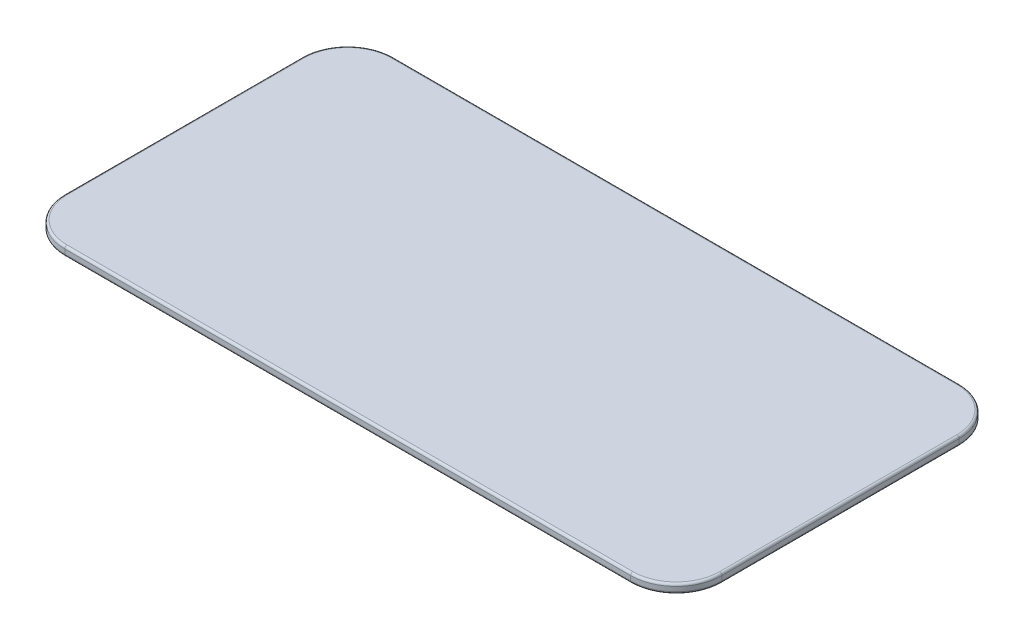
ISO-10303-21;
HEADER;
FILE_DESCRIPTION(('STEP AP214'),'2;1');
FILE_NAME('part.step','',(''),(''),'','','');
FILE_SCHEMA(('AUTOMOTIVE_DESIGN { 1 0 10303 214 1 1 1 1 }'));
ENDSEC;
DATA;
#1=APPLICATION_CONTEXT('core data for automotive mechanical design processes');
#2=APPLICATION_PROTOCOL_DEFINITION('international standard','automotive_design',2000,#1);
#3=PRODUCT_CONTEXT('',#1,'mechanical');
#4=PRODUCT('Part','Part','',(#3));
#5=PRODUCT_RELATED_PRODUCT_CATEGORY('part','',(#4));
#6=PRODUCT_DEFINITION_FORMATION('','',#4);
#7=PRODUCT_DEFINITION_CONTEXT('part definition',#1,'design');
#8=PRODUCT_DEFINITION('design','',#6,#7);
#9=PRODUCT_DEFINITION_SHAPE('','',#8);
#10=(LENGTH_UNIT() NAMED_UNIT(*) SI_UNIT(.MILLI.,.METRE.));
#11=(NAMED_UNIT(*) PLANE_ANGLE_UNIT() SI_UNIT($,.RADIAN.));
#12=(NAMED_UNIT(*) SI_UNIT($,.STERADIAN.) SOLID_ANGLE_UNIT());
#13=UNCERTAINTY_MEASURE_WITH_UNIT(LENGTH_MEASURE(1.E-05),#10,'distance_accuracy_value','');
#14=(GEOMETRIC_REPRESENTATION_CONTEXT(3) GLOBAL_UNCERTAINTY_ASSIGNED_CONTEXT((#13)) GLOBAL_UNIT_ASSIGNED_CONTEXT((#10,
#11,#12)) REPRESENTATION_CONTEXT('',''));
#15=CARTESIAN_POINT('',(0.,0.,0.));
#16=DIRECTION('',(0.,0.,1.));
#17=DIRECTION('',(1.,0.,0.));
#18=AXIS2_PLACEMENT_3D('',#15,#16,#17);
#19=CARTESIAN_POINT('',(914.4,25.4,457.2));
#20=DIRECTION('',(-1.,0.,0.));
#21=DIRECTION('',(0.,0.,1.));
#22=AXIS2_PLACEMENT_3D('',#19,#20,#21);
#23=PLANE('',#22);
#24=DIRECTION('',(0.,-1.,0.));
#25=VECTOR('',#24,1.);
#26=CARTESIAN_POINT('',(914.4,25.4,330.2));
#27=LINE('',#26,#25);
#28=CARTESIAN_POINT('',(914.4,19.05,330.2));
#29=VERTEX_POINT('',#28);
#30=CARTESIAN_POINT('',(914.4,6.35,330.2));
#31=VERTEX_POINT('',#30);
#32=EDGE_CURVE('E355',#29,#31,#27,.T.);
#33=ORIENTED_EDGE('',*,*,#32,.T.);
#34=DIRECTION('',(0.,0.,-1.));
#35=VECTOR('',#34,1.);
#36=CARTESIAN_POINT('',(914.4,6.35,-330.2));
#37=LINE('',#36,#35);
#38=CARTESIAN_POINT('',(914.4,6.35,-330.2));
#39=VERTEX_POINT('',#38);
#40=EDGE_CURVE('E213',#31,#39,#37,.T.);
#41=ORIENTED_EDGE('',*,*,#40,.T.);
#42=DIRECTION('',(0.,-1.,0.));
#43=VECTOR('',#42,1.);
#44=CARTESIAN_POINT('',(914.4,25.4,-330.2));
#45=LINE('',#44,#43);
#46=CARTESIAN_POINT('',(914.4,19.05,-330.2));
#47=VERTEX_POINT('',#46);
#48=EDGE_CURVE('E180',#39,#47,#45,.F.);
#49=ORIENTED_EDGE('',*,*,#48,.T.);
#50=DIRECTION('',(0.,0.,-1.));
#51=VECTOR('',#50,1.);
#52=CARTESIAN_POINT('',(914.4,19.05,457.2));
#53=LINE('',#52,#51);
#54=EDGE_CURVE('E210',#47,#29,#53,.F.);
#55=ORIENTED_EDGE('',*,*,#54,.T.);
#56=EDGE_LOOP('',(#33,#41,#49,#55));
#57=FACE_BOUND('',#56,.T.);
#58=ADVANCED_FACE('F44',(#57),#23,.F.);
#59=CARTESIAN_POINT('',(-914.4,25.4,-457.2));
#60=DIRECTION('',(0.,0.,1.));
#61=DIRECTION('',(1.,0.,0.));
#62=AXIS2_PLACEMENT_3D('',#59,#60,#61);
#63=PLANE('',#62);
#64=DIRECTION('',(0.,-1.,0.));
#65=VECTOR('',#64,1.);
#66=CARTESIAN_POINT('',(787.4,25.4,-457.2));
#67=LINE('',#66,#65);
#68=CARTESIAN_POINT('',(787.4,19.05,-457.2));
#69=VERTEX_POINT('',#68);
#70=CARTESIAN_POINT('',(787.4,6.35,-457.2));
#71=VERTEX_POINT('',#70);
#72=EDGE_CURVE('E339',#69,#71,#67,.T.);
#73=ORIENTED_EDGE('',*,*,#72,.T.);
#74=DIRECTION('',(-1.,0.,0.));
#75=VECTOR('',#74,1.);
#76=CARTESIAN_POINT('',(-787.400000000001,6.35,-457.2));
#77=LINE('',#76,#75);
#78=CARTESIAN_POINT('',(-787.4,6.35,-457.2));
#79=VERTEX_POINT('',#78);
#80=EDGE_CURVE('E226',#71,#79,#77,.T.);
#81=ORIENTED_EDGE('',*,*,#80,.T.);
#82=DIRECTION('',(0.,-1.,0.));
#83=VECTOR('',#82,1.);
#84=CARTESIAN_POINT('',(-787.4,25.4,-457.2));
#85=LINE('',#84,#83);
#86=CARTESIAN_POINT('',(-787.4,19.05,-457.2));
#87=VERTEX_POINT('',#86);
#88=EDGE_CURVE('E345',#79,#87,#85,.F.);
#89=ORIENTED_EDGE('',*,*,#88,.T.);
#90=DIRECTION('',(-1.,0.,0.));
#91=VECTOR('',#90,1.);
#92=CARTESIAN_POINT('',(-914.4,19.05,-457.2));
#93=LINE('',#92,#91);
#94=EDGE_CURVE('E223',#87,#69,#93,.F.);
#95=ORIENTED_EDGE('',*,*,#94,.T.);
#96=EDGE_LOOP('',(#73,#81,#89,#95));
#97=FACE_BOUND('',#96,.T.);
#98=ADVANCED_FACE('F413',(#97),#63,.F.);
#99=CARTESIAN_POINT('',(-914.4,25.4,457.2));
#100=DIRECTION('',(1.,0.,0.));
#101=DIRECTION('',(0.,0.,-1.));
#102=AXIS2_PLACEMENT_3D('',#99,#100,#101);
#103=PLANE('',#102);
#104=DIRECTION('',(0.,-1.,0.));
#105=VECTOR('',#104,1.);
#106=CARTESIAN_POINT('',(-914.4,25.4,-330.2));
#107=LINE('',#106,#105);
#108=CARTESIAN_POINT('',(-914.4,19.05,-330.2));
#109=VERTEX_POINT('',#108);
#110=CARTESIAN_POINT('',(-914.4,6.35,-330.2));
#111=VERTEX_POINT('',#110);
#112=EDGE_CURVE('E336',#109,#111,#107,.T.);
#113=ORIENTED_EDGE('',*,*,#112,.T.);
#114=DIRECTION('',(0.,0.,1.));
#115=VECTOR('',#114,1.);
#116=CARTESIAN_POINT('',(-914.4,6.35,330.2));
#117=LINE('',#116,#115);
#118=CARTESIAN_POINT('',(-914.4,6.35,330.2));
#119=VERTEX_POINT('',#118);
#120=EDGE_CURVE('E238',#111,#119,#117,.T.);
#121=ORIENTED_EDGE('',*,*,#120,.T.);
#122=DIRECTION('',(0.,-1.,0.));
#123=VECTOR('',#122,1.);
#124=CARTESIAN_POINT('',(-914.4,25.4,330.2));
#125=LINE('',#124,#123);
#126=CARTESIAN_POINT('',(-914.4,19.05,330.2));
#127=VERTEX_POINT('',#126);
#128=EDGE_CURVE('E284',#119,#127,#125,.F.);
#129=ORIENTED_EDGE('',*,*,#128,.T.);
#130=DIRECTION('',(0.,0.,1.));
#131=VECTOR('',#130,1.);
#132=CARTESIAN_POINT('',(-914.4,19.05,457.2));
#133=LINE('',#132,#131);
#134=EDGE_CURVE('E235',#127,#109,#133,.F.);
#135=ORIENTED_EDGE('',*,*,#134,.T.);
#136=EDGE_LOOP('',(#113,#121,#129,#135));
#137=FACE_BOUND('',#136,.T.);
#138=ADVANCED_FACE('F333',(#137),#103,.F.);
#139=CARTESIAN_POINT('',(-914.4,25.4,457.2));
#140=DIRECTION('',(0.,0.,-1.));
#141=DIRECTION('',(-1.,0.,0.));
#142=AXIS2_PLACEMENT_3D('',#139,#140,#141);
#143=PLANE('',#142);
#144=DIRECTION('',(0.,-1.,0.));
#145=VECTOR('',#144,1.);
#146=CARTESIAN_POINT('',(-787.4,25.4,457.2));
#147=LINE('',#146,#145);
#148=CARTESIAN_POINT('',(-787.4,19.05,457.2));
#149=VERTEX_POINT('',#148);
#150=CARTESIAN_POINT('',(-787.4,6.35,457.2));
#151=VERTEX_POINT('',#150);
#152=EDGE_CURVE('E330',#149,#151,#147,.T.);
#153=ORIENTED_EDGE('',*,*,#152,.T.);
#154=DIRECTION('',(1.,0.,0.));
#155=VECTOR('',#154,1.);
#156=CARTESIAN_POINT('',(787.4,6.35,457.2));
#157=LINE('',#156,#155);
#158=CARTESIAN_POINT('',(787.4,6.35,457.2));
#159=VERTEX_POINT('',#158);
#160=EDGE_CURVE('E201',#151,#159,#157,.T.);
#161=ORIENTED_EDGE('',*,*,#160,.T.);
#162=DIRECTION('',(0.,-1.,0.));
#163=VECTOR('',#162,1.);
#164=CARTESIAN_POINT('',(787.4,25.4,457.2));
#165=LINE('',#164,#163);
#166=CARTESIAN_POINT('',(787.4,19.05,457.2));
#167=VERTEX_POINT('',#166);
#168=EDGE_CURVE('E349',#159,#167,#165,.F.);
#169=ORIENTED_EDGE('',*,*,#168,.T.);
#170=DIRECTION('',(1.,0.,0.));
#171=VECTOR('',#170,1.);
#172=CARTESIAN_POINT('',(-914.4,19.05,457.2));
#173=LINE('',#172,#171);
#174=EDGE_CURVE('E198',#167,#149,#173,.F.);
#175=ORIENTED_EDGE('',*,*,#174,.T.);
#176=EDGE_LOOP('',(#153,#161,#169,#175));
#177=FACE_BOUND('',#176,.T.);
#178=ADVANCED_FACE('F385',(#177),#143,.F.);
#179=CARTESIAN_POINT('',(0.,25.4,0.));
#180=DIRECTION('',(0.,-1.,0.));
#181=DIRECTION('',(0.,0.,-1.));
#182=AXIS2_PLACEMENT_3D('',#179,#180,#181);
#183=PLANE('',#182);
#184=DIRECTION('',(0.,0.,-1.));
#185=VECTOR('',#184,1.);
#186=CARTESIAN_POINT('',(908.05,25.4,0.));
#187=LINE('',#186,#185);
#188=CARTESIAN_POINT('',(908.05,25.4,330.2));
#189=VERTEX_POINT('',#188);
#190=CARTESIAN_POINT('',(908.05,25.4,-330.2));
#191=VERTEX_POINT('',#190);
#192=EDGE_CURVE('E54',#189,#191,#187,.T.);
#193=ORIENTED_EDGE('',*,*,#192,.T.);
#194=CARTESIAN_POINT('',(787.4,25.4,-330.2));
#195=DIRECTION('',(0.,-1.,0.));
#196=DIRECTION('',(0.,0.,-1.));
#197=AXIS2_PLACEMENT_3D('',#194,#195,#196);
#198=CIRCLE('',#197,120.65);
#199=CARTESIAN_POINT('',(787.4,25.4,-450.85));
#200=VERTEX_POINT('',#199);
#201=EDGE_CURVE('E11',#191,#200,#198,.F.);
#202=ORIENTED_EDGE('',*,*,#201,.T.);
#203=DIRECTION('',(-1.,0.,0.));
#204=VECTOR('',#203,1.);
#205=CARTESIAN_POINT('',(0.,25.4,-450.85));
#206=LINE('',#205,#204);
#207=CARTESIAN_POINT('',(-787.4,25.4,-450.85));
#208=VERTEX_POINT('',#207);
#209=EDGE_CURVE('E241',#200,#208,#206,.T.);
#210=ORIENTED_EDGE('',*,*,#209,.T.);
#211=CARTESIAN_POINT('',(-787.4,25.4,-330.2));
#212=DIRECTION('',(0.,-1.,0.));
#213=DIRECTION('',(0.,0.,-1.));
#214=AXIS2_PLACEMENT_3D('',#211,#212,#213);
#215=CIRCLE('',#214,120.65);
#216=CARTESIAN_POINT('',(-908.050000000001,25.4,-330.2));
#217=VERTEX_POINT('',#216);
#218=EDGE_CURVE('E244',#208,#217,#215,.F.);
#219=ORIENTED_EDGE('',*,*,#218,.T.);
#220=DIRECTION('',(0.,0.,1.));
#221=VECTOR('',#220,1.);
#222=CARTESIAN_POINT('',(-908.050000000001,25.4,0.));
#223=LINE('',#222,#221);
#224=CARTESIAN_POINT('',(-908.050000000001,25.4,330.2));
#225=VERTEX_POINT('',#224);
#226=EDGE_CURVE('E247',#217,#225,#223,.T.);
#227=ORIENTED_EDGE('',*,*,#226,.T.);
#228=CARTESIAN_POINT('',(-787.4,25.4,330.2));
#229=DIRECTION('',(0.,-1.,0.));
#230=DIRECTION('',(0.,0.,-1.));
#231=AXIS2_PLACEMENT_3D('',#228,#229,#230);
#232=CIRCLE('',#231,120.65);
#233=CARTESIAN_POINT('',(-787.4,25.4,450.85));
#234=VERTEX_POINT('',#233);
#235=EDGE_CURVE('E250',#225,#234,#232,.F.);
#236=ORIENTED_EDGE('',*,*,#235,.T.);
#237=DIRECTION('',(1.,0.,0.));
#238=VECTOR('',#237,1.);
#239=CARTESIAN_POINT('',(0.,25.4,450.85));
#240=LINE('',#239,#238);
#241=CARTESIAN_POINT('',(787.4,25.4,450.85));
#242=VERTEX_POINT('',#241);
#243=EDGE_CURVE('E253',#234,#242,#240,.T.);
#244=ORIENTED_EDGE('',*,*,#243,.T.);
#245=CARTESIAN_POINT('',(787.4,25.4,330.2));
#246=DIRECTION('',(0.,-1.,0.));
#247=DIRECTION('',(0.,0.,-1.));
#248=AXIS2_PLACEMENT_3D('',#245,#246,#247);
#249=CIRCLE('',#248,120.65);
#250=EDGE_CURVE('E65',#242,#189,#249,.F.);
#251=ORIENTED_EDGE('',*,*,#250,.T.);
#252=EDGE_LOOP('',(#193,#202,#210,#219,#227,#236,#244,#251));
#253=FACE_BOUND('',#252,.T.);
#254=ADVANCED_FACE('F401',(#253),#183,.F.);
#255=CARTESIAN_POINT('',(0.,0.,0.));
#256=DIRECTION('',(0.,-1.,0.));
#257=DIRECTION('',(0.,0.,-1.));
#258=AXIS2_PLACEMENT_3D('',#255,#256,#257);
#259=PLANE('',#258);
#260=DIRECTION('',(1.,0.,0.));
#261=VECTOR('',#260,1.);
#262=CARTESIAN_POINT('',(-787.400000000001,0.,450.85));
#263=LINE('',#262,#261);
#264=CARTESIAN_POINT('',(787.4,0.,450.85));
#265=VERTEX_POINT('',#264);
#266=CARTESIAN_POINT('',(-787.4,0.,450.85));
#267=VERTEX_POINT('',#266);
#268=EDGE_CURVE('E184',#265,#267,#263,.F.);
#269=ORIENTED_EDGE('',*,*,#268,.T.);
#270=CARTESIAN_POINT('',(-787.4,0.,330.2));
#271=DIRECTION('',(0.,-1.,0.));
#272=DIRECTION('',(0.,0.,-1.));
#273=AXIS2_PLACEMENT_3D('',#270,#271,#272);
#274=CIRCLE('',#273,120.65);
#275=CARTESIAN_POINT('',(-908.050000000001,0.,330.2));
#276=VERTEX_POINT('',#275);
#277=EDGE_CURVE('E163',#267,#276,#274,.T.);
#278=ORIENTED_EDGE('',*,*,#277,.T.);
#279=DIRECTION('',(0.,0.,1.));
#280=VECTOR('',#279,1.);
#281=CARTESIAN_POINT('',(-908.050000000001,0.,-330.2));
#282=LINE('',#281,#280);
#283=CARTESIAN_POINT('',(-908.050000000001,0.,-330.2));
#284=VERTEX_POINT('',#283);
#285=EDGE_CURVE('E172',#276,#284,#282,.F.);
#286=ORIENTED_EDGE('',*,*,#285,.T.);
#287=CARTESIAN_POINT('',(-787.4,0.,-330.2));
#288=DIRECTION('',(0.,-1.,0.));
#289=DIRECTION('',(0.,0.,-1.));
#290=AXIS2_PLACEMENT_3D('',#287,#288,#289);
#291=CIRCLE('',#290,120.65);
#292=CARTESIAN_POINT('',(-787.4,0.,-450.85));
#293=VERTEX_POINT('',#292);
#294=EDGE_CURVE('E179',#284,#293,#291,.T.);
#295=ORIENTED_EDGE('',*,*,#294,.T.);
#296=DIRECTION('',(-1.,0.,0.));
#297=VECTOR('',#296,1.);
#298=CARTESIAN_POINT('',(787.4,0.,-450.85));
#299=LINE('',#298,#297);
#300=CARTESIAN_POINT('',(787.4,0.,-450.85));
#301=VERTEX_POINT('',#300);
#302=EDGE_CURVE('E364',#293,#301,#299,.F.);
#303=ORIENTED_EDGE('',*,*,#302,.T.);
#304=CARTESIAN_POINT('',(787.4,0.,-330.2));
#305=DIRECTION('',(0.,-1.,0.));
#306=DIRECTION('',(0.,0.,-1.));
#307=AXIS2_PLACEMENT_3D('',#304,#305,#306);
#308=CIRCLE('',#307,120.65);
#309=CARTESIAN_POINT('',(908.05,0.,-330.2));
#310=VERTEX_POINT('',#309);
#311=EDGE_CURVE('E367',#301,#310,#308,.T.);
#312=ORIENTED_EDGE('',*,*,#311,.T.);
#313=DIRECTION('',(0.,0.,-1.));
#314=VECTOR('',#313,1.);
#315=CARTESIAN_POINT('',(908.05,0.,330.2));
#316=LINE('',#315,#314);
#317=CARTESIAN_POINT('',(908.05,0.,330.2));
#318=VERTEX_POINT('',#317);
#319=EDGE_CURVE('E370',#310,#318,#316,.F.);
#320=ORIENTED_EDGE('',*,*,#319,.T.);
#321=CARTESIAN_POINT('',(787.4,0.,330.2));
#322=DIRECTION('',(0.,-1.,0.));
#323=DIRECTION('',(0.,0.,-1.));
#324=AXIS2_PLACEMENT_3D('',#321,#322,#323);
#325=CIRCLE('',#324,120.65);
#326=EDGE_CURVE('E192',#318,#265,#325,.T.);
#327=ORIENTED_EDGE('',*,*,#326,.T.);
#328=EDGE_LOOP('',(#269,#278,#286,#295,#303,#312,#320,#327));
#329=FACE_BOUND('',#328,.T.);
#330=ADVANCED_FACE('F182',(#329),#259,.T.);
#331=CARTESIAN_POINT('',(-787.4,25.4,-330.2));
#332=DIRECTION('',(0.,-1.,0.));
#333=DIRECTION('',(0.,0.,-1.));
#334=AXIS2_PLACEMENT_3D('',#331,#332,#333);
#335=CYLINDRICAL_SURFACE('',#334,127.);
#336=ORIENTED_EDGE('',*,*,#88,.F.);
#337=CARTESIAN_POINT('',(-787.4,6.35,-330.2));
#338=DIRECTION('',(0.,-1.,0.));
#339=DIRECTION('',(0.,0.,-1.));
#340=AXIS2_PLACEMENT_3D('',#337,#338,#339);
#341=CIRCLE('',#340,127.);
#342=EDGE_CURVE('E232',#79,#111,#341,.F.);
#343=ORIENTED_EDGE('',*,*,#342,.T.);
#344=ORIENTED_EDGE('',*,*,#112,.F.);
#345=CARTESIAN_POINT('',(-787.4,19.05,-330.2));
#346=DIRECTION('',(0.,-1.,0.));
#347=DIRECTION('',(0.,0.,-1.));
#348=AXIS2_PLACEMENT_3D('',#345,#346,#347);
#349=CIRCLE('',#348,127.);
#350=EDGE_CURVE('E229',#109,#87,#349,.T.);
#351=ORIENTED_EDGE('',*,*,#350,.T.);
#352=EDGE_LOOP('',(#336,#343,#344,#351));
#353=FACE_BOUND('',#352,.T.);
#354=ADVANCED_FACE('F437',(#353),#335,.T.);
#355=CARTESIAN_POINT('',(-787.4,25.4,330.2));
#356=DIRECTION('',(0.,-1.,0.));
#357=DIRECTION('',(0.,0.,-1.));
#358=AXIS2_PLACEMENT_3D('',#355,#356,#357);
#359=CYLINDRICAL_SURFACE('',#358,127.);
#360=ORIENTED_EDGE('',*,*,#128,.F.);
#361=CARTESIAN_POINT('',(-787.4,6.35,330.2));
#362=DIRECTION('',(0.,-1.,0.));
#363=DIRECTION('',(0.,0.,-1.));
#364=AXIS2_PLACEMENT_3D('',#361,#362,#363);
#365=CIRCLE('',#364,127.);
#366=EDGE_CURVE('E165',#119,#151,#365,.F.);
#367=ORIENTED_EDGE('',*,*,#366,.T.);
#368=ORIENTED_EDGE('',*,*,#152,.F.);
#369=CARTESIAN_POINT('',(-787.4,19.05,330.2));
#370=DIRECTION('',(0.,-1.,0.));
#371=DIRECTION('',(0.,0.,-1.));
#372=AXIS2_PLACEMENT_3D('',#369,#370,#371);
#373=CIRCLE('',#372,127.);
#374=EDGE_CURVE('E187',#149,#127,#373,.T.);
#375=ORIENTED_EDGE('',*,*,#374,.T.);
#376=EDGE_LOOP('',(#360,#367,#368,#375));
#377=FACE_BOUND('',#376,.T.);
#378=ADVANCED_FACE('F328',(#377),#359,.T.);
#379=CARTESIAN_POINT('',(787.4,25.4,-330.2));
#380=DIRECTION('',(0.,-1.,0.));
#381=DIRECTION('',(0.,0.,-1.));
#382=AXIS2_PLACEMENT_3D('',#379,#380,#381);
#383=CYLINDRICAL_SURFACE('',#382,127.);
#384=ORIENTED_EDGE('',*,*,#48,.F.);
#385=CARTESIAN_POINT('',(787.4,6.35,-330.2));
#386=DIRECTION('',(0.,-1.,0.));
#387=DIRECTION('',(0.,0.,-1.));
#388=AXIS2_PLACEMENT_3D('',#385,#386,#387);
#389=CIRCLE('',#388,127.);
#390=EDGE_CURVE('E220',#39,#71,#389,.F.);
#391=ORIENTED_EDGE('',*,*,#390,.T.);
#392=ORIENTED_EDGE('',*,*,#72,.F.);
#393=CARTESIAN_POINT('',(787.4,19.05,-330.2));
#394=DIRECTION('',(0.,-1.,0.));
#395=DIRECTION('',(0.,0.,-1.));
#396=AXIS2_PLACEMENT_3D('',#393,#394,#395);
#397=CIRCLE('',#396,127.);
#398=EDGE_CURVE('E216',#69,#47,#397,.T.);
#399=ORIENTED_EDGE('',*,*,#398,.T.);
#400=EDGE_LOOP('',(#384,#391,#392,#399));
#401=FACE_BOUND('',#400,.T.);
#402=ADVANCED_FACE('F418',(#401),#383,.T.);
#403=CARTESIAN_POINT('',(787.4,25.4,330.2));
#404=DIRECTION('',(0.,-1.,0.));
#405=DIRECTION('',(0.,0.,-1.));
#406=AXIS2_PLACEMENT_3D('',#403,#404,#405);
#407=CYLINDRICAL_SURFACE('',#406,127.);
#408=ORIENTED_EDGE('',*,*,#168,.F.);
#409=CARTESIAN_POINT('',(787.4,6.35,330.2));
#410=DIRECTION('',(0.,-1.,0.));
#411=DIRECTION('',(0.,0.,-1.));
#412=AXIS2_PLACEMENT_3D('',#409,#410,#411);
#413=CIRCLE('',#412,127.);
#414=EDGE_CURVE('E207',#159,#31,#413,.F.);
#415=ORIENTED_EDGE('',*,*,#414,.T.);
#416=ORIENTED_EDGE('',*,*,#32,.F.);
#417=CARTESIAN_POINT('',(787.4,19.05,330.2));
#418=DIRECTION('',(0.,-1.,0.));
#419=DIRECTION('',(0.,0.,-1.));
#420=AXIS2_PLACEMENT_3D('',#417,#418,#419);
#421=CIRCLE('',#420,127.);
#422=EDGE_CURVE('E204',#29,#167,#421,.T.);
#423=ORIENTED_EDGE('',*,*,#422,.T.);
#424=EDGE_LOOP('',(#408,#415,#416,#423));
#425=FACE_BOUND('',#424,.T.);
#426=ADVANCED_FACE('F387',(#425),#407,.T.);
#427=CARTESIAN_POINT('',(787.4,6.35,-330.2));
#428=DIRECTION('',(0.,-1.,0.));
#429=DIRECTION('',(0.,0.,-1.));
#430=AXIS2_PLACEMENT_3D('',#427,#428,#429);
#431=TOROIDAL_SURFACE('',#430,120.65,6.35);
#432=CARTESIAN_POINT('',(787.4,6.35,-450.85));
#433=DIRECTION('',(-1.,0.,0.));
#434=DIRECTION('',(0.,0.,1.));
#435=AXIS2_PLACEMENT_3D('',#432,#433,#434);
#436=CIRCLE('',#435,6.35);
#437=EDGE_CURVE('E276',#71,#301,#436,.T.);
#438=ORIENTED_EDGE('',*,*,#437,.F.);
#439=ORIENTED_EDGE('',*,*,#390,.F.);
#440=CARTESIAN_POINT('',(908.05,6.35,-330.2));
#441=DIRECTION('',(0.,0.,1.));
#442=DIRECTION('',(1.,0.,0.));
#443=AXIS2_PLACEMENT_3D('',#440,#441,#442);
#444=CIRCLE('',#443,6.35);
#445=EDGE_CURVE('E280',#310,#39,#444,.T.);
#446=ORIENTED_EDGE('',*,*,#445,.F.);
#447=ORIENTED_EDGE('',*,*,#311,.F.);
#448=EDGE_LOOP('',(#438,#439,#446,#447));
#449=FACE_BOUND('',#448,.T.);
#450=ADVANCED_FACE('F422',(#449),#431,.T.);
#451=CARTESIAN_POINT('',(908.05,6.35,457.2));
#452=DIRECTION('',(0.,0.,1.));
#453=DIRECTION('',(1.,0.,0.));
#454=AXIS2_PLACEMENT_3D('',#451,#452,#453);
#455=CYLINDRICAL_SURFACE('',#454,6.35);
#456=ORIENTED_EDGE('',*,*,#445,.T.);
#457=ORIENTED_EDGE('',*,*,#40,.F.);
#458=CARTESIAN_POINT('',(908.05,6.35,330.2));
#459=DIRECTION('',(0.,0.,1.));
#460=DIRECTION('',(1.,0.,0.));
#461=AXIS2_PLACEMENT_3D('',#458,#459,#460);
#462=CIRCLE('',#461,6.35);
#463=EDGE_CURVE('E272',#318,#31,#462,.T.);
#464=ORIENTED_EDGE('',*,*,#463,.F.);
#465=ORIENTED_EDGE('',*,*,#319,.F.);
#466=EDGE_LOOP('',(#456,#457,#464,#465));
#467=FACE_BOUND('',#466,.T.);
#468=ADVANCED_FACE('F427',(#467),#455,.T.);
#469=CARTESIAN_POINT('',(-914.4,6.35,-450.85));
#470=DIRECTION('',(1.,0.,0.));
#471=DIRECTION('',(0.,0.,-1.));
#472=AXIS2_PLACEMENT_3D('',#469,#470,#471);
#473=CYLINDRICAL_SURFACE('',#472,6.35);
#474=ORIENTED_EDGE('',*,*,#437,.T.);
#475=ORIENTED_EDGE('',*,*,#302,.F.);
#476=CARTESIAN_POINT('',(-787.4,6.35,-450.85));
#477=DIRECTION('',(-1.,0.,0.));
#478=DIRECTION('',(0.,0.,1.));
#479=AXIS2_PLACEMENT_3D('',#476,#477,#478);
#480=CIRCLE('',#479,6.35);
#481=EDGE_CURVE('E268',#79,#293,#480,.T.);
#482=ORIENTED_EDGE('',*,*,#481,.F.);
#483=ORIENTED_EDGE('',*,*,#80,.F.);
#484=EDGE_LOOP('',(#474,#475,#482,#483));
#485=FACE_BOUND('',#484,.T.);
#486=ADVANCED_FACE('F459',(#485),#473,.T.);
#487=CARTESIAN_POINT('',(787.4,6.35,330.2));
#488=DIRECTION('',(0.,-1.,0.));
#489=DIRECTION('',(0.,0.,-1.));
#490=AXIS2_PLACEMENT_3D('',#487,#488,#489);
#491=TOROIDAL_SURFACE('',#490,120.65,6.35);
#492=ORIENTED_EDGE('',*,*,#463,.T.);
#493=ORIENTED_EDGE('',*,*,#414,.F.);
#494=CARTESIAN_POINT('',(787.4,6.35,450.85));
#495=DIRECTION('',(-1.,0.,0.));
#496=DIRECTION('',(0.,0.,1.));
#497=AXIS2_PLACEMENT_3D('',#494,#495,#496);
#498=CIRCLE('',#497,6.35);
#499=EDGE_CURVE('E264',#265,#159,#498,.T.);
#500=ORIENTED_EDGE('',*,*,#499,.F.);
#501=ORIENTED_EDGE('',*,*,#326,.F.);
#502=EDGE_LOOP('',(#492,#493,#500,#501));
#503=FACE_BOUND('',#502,.T.);
#504=ADVANCED_FACE('F379',(#503),#491,.T.);
#505=CARTESIAN_POINT('',(-787.4,6.35,-330.2));
#506=DIRECTION('',(0.,-1.,0.));
#507=DIRECTION('',(0.,0.,-1.));
#508=AXIS2_PLACEMENT_3D('',#505,#506,#507);
#509=TOROIDAL_SURFACE('',#508,120.65,6.35);
#510=ORIENTED_EDGE('',*,*,#481,.T.);
#511=ORIENTED_EDGE('',*,*,#294,.F.);
#512=CARTESIAN_POINT('',(-908.050000000001,6.35,-330.2));
#513=DIRECTION('',(0.,0.,1.));
#514=DIRECTION('',(1.,0.,0.));
#515=AXIS2_PLACEMENT_3D('',#512,#513,#514);
#516=CIRCLE('',#515,6.35);
#517=EDGE_CURVE('E175',#111,#284,#516,.T.);
#518=ORIENTED_EDGE('',*,*,#517,.F.);
#519=ORIENTED_EDGE('',*,*,#342,.F.);
#520=EDGE_LOOP('',(#510,#511,#518,#519));
#521=FACE_BOUND('',#520,.T.);
#522=ADVANCED_FACE('F453',(#521),#509,.T.);
#523=CARTESIAN_POINT('',(-914.4,6.35,450.85));
#524=DIRECTION('',(-1.,0.,0.));
#525=DIRECTION('',(0.,0.,1.));
#526=AXIS2_PLACEMENT_3D('',#523,#524,#525);
#527=CYLINDRICAL_SURFACE('',#526,6.35);
#528=ORIENTED_EDGE('',*,*,#499,.T.);
#529=ORIENTED_EDGE('',*,*,#160,.F.);
#530=CARTESIAN_POINT('',(-787.4,6.35,450.85));
#531=DIRECTION('',(-1.,0.,0.));
#532=DIRECTION('',(0.,0.,1.));
#533=AXIS2_PLACEMENT_3D('',#530,#531,#532);
#534=CIRCLE('',#533,6.35);
#535=EDGE_CURVE('E169',#267,#151,#534,.T.);
#536=ORIENTED_EDGE('',*,*,#535,.F.);
#537=ORIENTED_EDGE('',*,*,#268,.F.);
#538=EDGE_LOOP('',(#528,#529,#536,#537));
#539=FACE_BOUND('',#538,.T.);
#540=ADVANCED_FACE('F382',(#539),#527,.T.);
#541=CARTESIAN_POINT('',(-908.050000000001,6.35,457.2));
#542=DIRECTION('',(0.,0.,-1.));
#543=DIRECTION('',(-1.,0.,0.));
#544=AXIS2_PLACEMENT_3D('',#541,#542,#543);
#545=CYLINDRICAL_SURFACE('',#544,6.35);
#546=ORIENTED_EDGE('',*,*,#517,.T.);
#547=ORIENTED_EDGE('',*,*,#285,.F.);
#548=CARTESIAN_POINT('',(-908.050000000001,6.35,330.2));
#549=DIRECTION('',(0.,0.,1.));
#550=DIRECTION('',(1.,0.,0.));
#551=AXIS2_PLACEMENT_3D('',#548,#549,#550);
#552=CIRCLE('',#551,6.35);
#553=EDGE_CURVE('E159',#119,#276,#552,.T.);
#554=ORIENTED_EDGE('',*,*,#553,.F.);
#555=ORIENTED_EDGE('',*,*,#120,.F.);
#556=EDGE_LOOP('',(#546,#547,#554,#555));
#557=FACE_BOUND('',#556,.T.);
#558=ADVANCED_FACE('F173',(#557),#545,.T.);
#559=CARTESIAN_POINT('',(-787.4,6.35,330.2));
#560=DIRECTION('',(0.,-1.,0.));
#561=DIRECTION('',(0.,0.,-1.));
#562=AXIS2_PLACEMENT_3D('',#559,#560,#561);
#563=TOROIDAL_SURFACE('',#562,120.65,6.35);
#564=ORIENTED_EDGE('',*,*,#535,.T.);
#565=ORIENTED_EDGE('',*,*,#366,.F.);
#566=ORIENTED_EDGE('',*,*,#553,.T.);
#567=ORIENTED_EDGE('',*,*,#277,.F.);
#568=EDGE_LOOP('',(#564,#565,#566,#567));
#569=FACE_BOUND('',#568,.T.);
#570=ADVANCED_FACE('F161',(#569),#563,.T.);
#571=CARTESIAN_POINT('',(-787.4,19.05,330.2));
#572=DIRECTION('',(0.,-1.,0.));
#573=DIRECTION('',(0.,0.,-1.));
#574=AXIS2_PLACEMENT_3D('',#571,#572,#573);
#575=TOROIDAL_SURFACE('',#574,120.65,6.35);
#576=CARTESIAN_POINT('',(-908.050000000001,19.05,330.2));
#577=DIRECTION('',(0.,0.,-1.));
#578=DIRECTION('',(-1.,0.,0.));
#579=AXIS2_PLACEMENT_3D('',#576,#577,#578);
#580=CIRCLE('',#579,6.35);
#581=EDGE_CURVE('E306',#127,#225,#580,.T.);
#582=ORIENTED_EDGE('',*,*,#581,.F.);
#583=ORIENTED_EDGE('',*,*,#374,.F.);
#584=CARTESIAN_POINT('',(-787.4,19.05,450.85));
#585=DIRECTION('',(1.,0.,0.));
#586=DIRECTION('',(0.,0.,-1.));
#587=AXIS2_PLACEMENT_3D('',#584,#585,#586);
#588=CIRCLE('',#587,6.35);
#589=EDGE_CURVE('E48',#234,#149,#588,.T.);
#590=ORIENTED_EDGE('',*,*,#589,.F.);
#591=ORIENTED_EDGE('',*,*,#235,.F.);
#592=EDGE_LOOP('',(#582,#583,#590,#591));
#593=FACE_BOUND('',#592,.T.);
#594=ADVANCED_FACE('F46',(#593),#575,.T.);
#595=CARTESIAN_POINT('',(0.,19.05,450.85));
#596=DIRECTION('',(1.,0.,0.));
#597=DIRECTION('',(0.,0.,-1.));
#598=AXIS2_PLACEMENT_3D('',#595,#596,#597);
#599=CYLINDRICAL_SURFACE('',#598,6.35);
#600=ORIENTED_EDGE('',*,*,#589,.T.);
#601=ORIENTED_EDGE('',*,*,#174,.F.);
#602=CARTESIAN_POINT('',(787.4,19.05,450.85));
#603=DIRECTION('',(1.,0.,0.));
#604=DIRECTION('',(0.,0.,-1.));
#605=AXIS2_PLACEMENT_3D('',#602,#603,#604);
#606=CIRCLE('',#605,6.35);
#607=EDGE_CURVE('E303',#242,#167,#606,.T.);
#608=ORIENTED_EDGE('',*,*,#607,.F.);
#609=ORIENTED_EDGE('',*,*,#243,.F.);
#610=EDGE_LOOP('',(#600,#601,#608,#609));
#611=FACE_BOUND('',#610,.T.);
#612=ADVANCED_FACE('F319',(#611),#599,.T.);
#613=CARTESIAN_POINT('',(-908.050000000001,19.05,0.));
#614=DIRECTION('',(0.,0.,1.));
#615=DIRECTION('',(1.,0.,0.));
#616=AXIS2_PLACEMENT_3D('',#613,#614,#615);
#617=CYLINDRICAL_SURFACE('',#616,6.35);
#618=ORIENTED_EDGE('',*,*,#581,.T.);
#619=ORIENTED_EDGE('',*,*,#226,.F.);
#620=CARTESIAN_POINT('',(-908.050000000001,19.05,-330.2));
#621=DIRECTION('',(0.,0.,-1.));
#622=DIRECTION('',(-1.,0.,0.));
#623=AXIS2_PLACEMENT_3D('',#620,#621,#622);
#624=CIRCLE('',#623,6.35);
#625=EDGE_CURVE('E299',#109,#217,#624,.T.);
#626=ORIENTED_EDGE('',*,*,#625,.F.);
#627=ORIENTED_EDGE('',*,*,#134,.F.);
#628=EDGE_LOOP('',(#618,#619,#626,#627));
#629=FACE_BOUND('',#628,.T.);
#630=ADVANCED_FACE('F477',(#629),#617,.T.);
#631=CARTESIAN_POINT('',(787.4,19.05,330.2));
#632=DIRECTION('',(0.,-1.,0.));
#633=DIRECTION('',(0.,0.,-1.));
#634=AXIS2_PLACEMENT_3D('',#631,#632,#633);
#635=TOROIDAL_SURFACE('',#634,120.65,6.35);
#636=ORIENTED_EDGE('',*,*,#607,.T.);
#637=ORIENTED_EDGE('',*,*,#422,.F.);
#638=CARTESIAN_POINT('',(908.05,19.05,330.2));
#639=DIRECTION('',(0.,0.,-1.));
#640=DIRECTION('',(-1.,0.,0.));
#641=AXIS2_PLACEMENT_3D('',#638,#639,#640);
#642=CIRCLE('',#641,6.35);
#643=EDGE_CURVE('E295',#189,#29,#642,.T.);
#644=ORIENTED_EDGE('',*,*,#643,.F.);
#645=ORIENTED_EDGE('',*,*,#250,.F.);
#646=EDGE_LOOP('',(#636,#637,#644,#645));
#647=FACE_BOUND('',#646,.T.);
#648=ADVANCED_FACE('F391',(#647),#635,.T.);
#649=CARTESIAN_POINT('',(-787.4,19.05,-330.2));
#650=DIRECTION('',(0.,-1.,0.));
#651=DIRECTION('',(0.,0.,-1.));
#652=AXIS2_PLACEMENT_3D('',#649,#650,#651);
#653=TOROIDAL_SURFACE('',#652,120.65,6.35);
#654=ORIENTED_EDGE('',*,*,#625,.T.);
#655=ORIENTED_EDGE('',*,*,#218,.F.);
#656=CARTESIAN_POINT('',(-787.4,19.05,-450.85));
#657=DIRECTION('',(1.,0.,0.));
#658=DIRECTION('',(0.,0.,-1.));
#659=AXIS2_PLACEMENT_3D('',#656,#657,#658);
#660=CIRCLE('',#659,6.35);
#661=EDGE_CURVE('E291',#87,#208,#660,.T.);
#662=ORIENTED_EDGE('',*,*,#661,.F.);
#663=ORIENTED_EDGE('',*,*,#350,.F.);
#664=EDGE_LOOP('',(#654,#655,#662,#663));
#665=FACE_BOUND('',#664,.T.);
#666=ADVANCED_FACE('F406',(#665),#653,.T.);
#667=CARTESIAN_POINT('',(908.05,19.05,0.));
#668=DIRECTION('',(0.,0.,-1.));
#669=DIRECTION('',(-1.,0.,0.));
#670=AXIS2_PLACEMENT_3D('',#667,#668,#669);
#671=CYLINDRICAL_SURFACE('',#670,6.35);
#672=ORIENTED_EDGE('',*,*,#643,.T.);
#673=ORIENTED_EDGE('',*,*,#54,.F.);
#674=CARTESIAN_POINT('',(908.05,19.05,-330.2));
#675=DIRECTION('',(0.,0.,-1.));
#676=DIRECTION('',(-1.,0.,0.));
#677=AXIS2_PLACEMENT_3D('',#674,#675,#676);
#678=CIRCLE('',#677,6.35);
#679=EDGE_CURVE('E288',#191,#47,#678,.T.);
#680=ORIENTED_EDGE('',*,*,#679,.F.);
#681=ORIENTED_EDGE('',*,*,#192,.F.);
#682=EDGE_LOOP('',(#672,#673,#680,#681));
#683=FACE_BOUND('',#682,.T.);
#684=ADVANCED_FACE('F394',(#683),#671,.T.);
#685=CARTESIAN_POINT('',(0.,19.05,-450.85));
#686=DIRECTION('',(-1.,0.,0.));
#687=DIRECTION('',(0.,0.,1.));
#688=AXIS2_PLACEMENT_3D('',#685,#686,#687);
#689=CYLINDRICAL_SURFACE('',#688,6.35);
#690=ORIENTED_EDGE('',*,*,#661,.T.);
#691=ORIENTED_EDGE('',*,*,#209,.F.);
#692=CARTESIAN_POINT('',(787.4,19.05,-450.85));
#693=DIRECTION('',(1.,0.,0.));
#694=DIRECTION('',(0.,0.,-1.));
#695=AXIS2_PLACEMENT_3D('',#692,#693,#694);
#696=CIRCLE('',#695,6.35);
#697=EDGE_CURVE('E285',#69,#200,#696,.T.);
#698=ORIENTED_EDGE('',*,*,#697,.F.);
#699=ORIENTED_EDGE('',*,*,#94,.F.);
#700=EDGE_LOOP('',(#690,#691,#698,#699));
#701=FACE_BOUND('',#700,.T.);
#702=ADVANCED_FACE('F410',(#701),#689,.T.);
#703=CARTESIAN_POINT('',(787.4,19.05,-330.2));
#704=DIRECTION('',(0.,-1.,0.));
#705=DIRECTION('',(0.,0.,-1.));
#706=AXIS2_PLACEMENT_3D('',#703,#704,#705);
#707=TOROIDAL_SURFACE('',#706,120.65,6.35);
#708=ORIENTED_EDGE('',*,*,#679,.T.);
#709=ORIENTED_EDGE('',*,*,#398,.F.);
#710=ORIENTED_EDGE('',*,*,#697,.T.);
#711=ORIENTED_EDGE('',*,*,#201,.F.);
#712=EDGE_LOOP('',(#708,#709,#710,#711));
#713=FACE_BOUND('',#712,.T.);
#714=ADVANCED_FACE('F398',(#713),#707,.T.);
#715=CLOSED_SHELL('',(#58,#98,#138,#178,#254,#330,#354,#378,#402,#426,#450,#468,#486,#504,#522,
#540,#558,#570,#594,#612,#630,#648,#666,#684,#702,#714));
#716=MANIFOLD_SOLID_BREP('B2',#715);
#717=ADVANCED_BREP_SHAPE_REPRESENTATION('',(#18,#716),#14);
#718=SHAPE_DEFINITION_REPRESENTATION(#9,#717);
ENDSEC;
END-ISO-10303-21;
